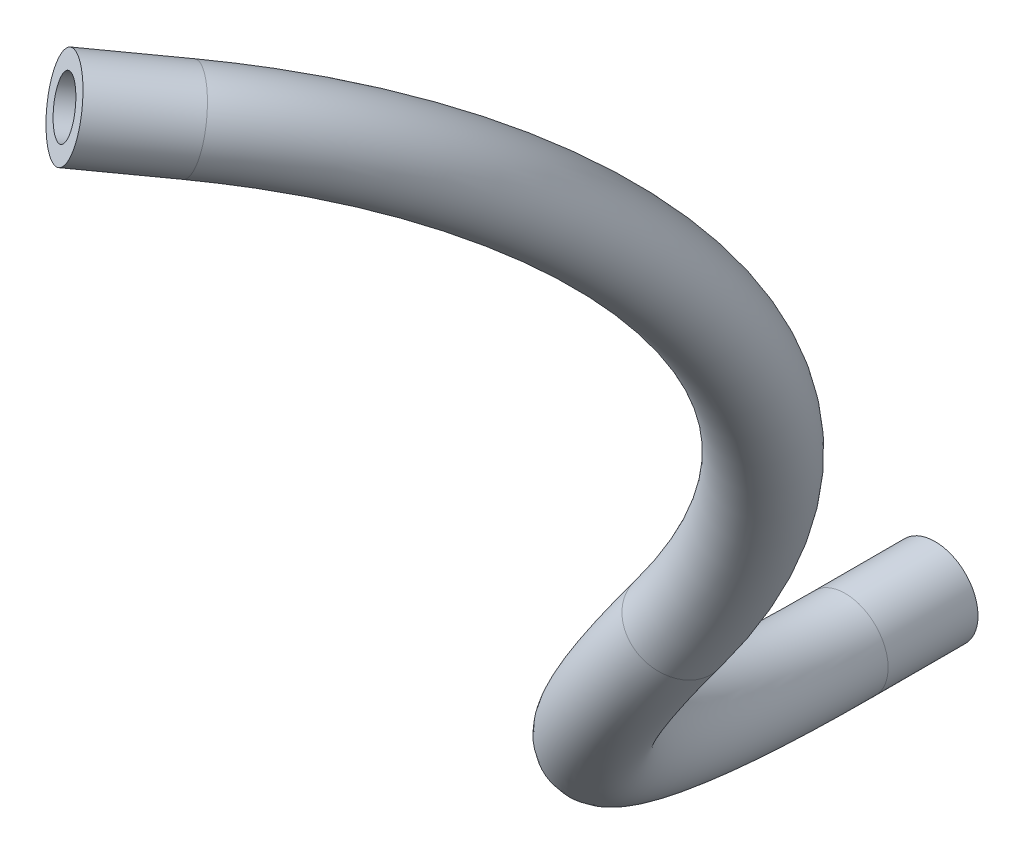
ISO-10303-21;
HEADER;
FILE_DESCRIPTION(('STEP AP214'),'2;1');
FILE_NAME('part.step','',(''),(''),'','','');
FILE_SCHEMA(('AUTOMOTIVE_DESIGN { 1 0 10303 214 1 1 1 1 }'));
ENDSEC;
DATA;
#1=APPLICATION_CONTEXT('core data for automotive mechanical design processes');
#2=APPLICATION_PROTOCOL_DEFINITION('international standard','automotive_design',2000,#1);
#3=PRODUCT_CONTEXT('',#1,'mechanical');
#4=PRODUCT('Part','Part','',(#3));
#5=PRODUCT_RELATED_PRODUCT_CATEGORY('part','',(#4));
#6=PRODUCT_DEFINITION_FORMATION('','',#4);
#7=PRODUCT_DEFINITION_CONTEXT('part definition',#1,'design');
#8=PRODUCT_DEFINITION('design','',#6,#7);
#9=PRODUCT_DEFINITION_SHAPE('','',#8);
#10=(LENGTH_UNIT() NAMED_UNIT(*) SI_UNIT(.MILLI.,.METRE.));
#11=(NAMED_UNIT(*) PLANE_ANGLE_UNIT() SI_UNIT($,.RADIAN.));
#12=(NAMED_UNIT(*) SI_UNIT($,.STERADIAN.) SOLID_ANGLE_UNIT());
#13=UNCERTAINTY_MEASURE_WITH_UNIT(LENGTH_MEASURE(1.E-05),#10,'distance_accuracy_value','');
#14=(GEOMETRIC_REPRESENTATION_CONTEXT(3) GLOBAL_UNCERTAINTY_ASSIGNED_CONTEXT((#13)) GLOBAL_UNIT_ASSIGNED_CONTEXT((#10,
#11,#12)) REPRESENTATION_CONTEXT('',''));
#15=CARTESIAN_POINT('',(0.,0.,0.));
#16=DIRECTION('',(0.,0.,1.));
#17=DIRECTION('',(1.,0.,0.));
#18=AXIS2_PLACEMENT_3D('',#15,#16,#17);
#19=CARTESIAN_POINT('',(46.6238954384085,-32.1259105562794,-21.9569738944376));
#20=DIRECTION('',(-1.65064558550588E-12,2.11386642951307E-12,1.));
#21=DIRECTION('',(0.,-1.,2.11386642951307E-12));
#22=AXIS2_PLACEMENT_3D('',#19,#20,#21);
#23=PLANE('',#22);
#24=CARTESIAN_POINT('',(46.6238954384085,-32.1259105562789,-21.9569738944376));
#25=DIRECTION('',(-1.65064558550588E-12,2.11386642951307E-12,1.));
#26=DIRECTION('',(0.,-1.,2.11386642951307E-12));
#27=AXIS2_PLACEMENT_3D('',#24,#25,#26);
#28=CIRCLE('',#27,6.35);
#29=CARTESIAN_POINT('',(46.6238954384085,-38.4759105562789,-21.9569738944242));
#30=VERTEX_POINT('',#29);
#31=EDGE_CURVE('E80',#30,#30,#28,.F.);
#32=ORIENTED_EDGE('',*,*,#31,.F.);
#33=EDGE_LOOP('',(#32));
#34=FACE_BOUND('',#33,.T.);
#35=CARTESIAN_POINT('',(46.6238954384085,-32.1259105562794,-21.9569738944376));
#36=DIRECTION('',(-1.65064558550588E-12,2.11386642951307E-12,1.));
#37=DIRECTION('',(0.,-1.,2.11386642951307E-12));
#38=AXIS2_PLACEMENT_3D('',#35,#36,#37);
#39=CIRCLE('',#38,10.31875);
#40=CARTESIAN_POINT('',(46.6238954384085,-42.4446605562794,-21.9569738944158));
#41=VERTEX_POINT('',#40);
#42=EDGE_CURVE('E77',#41,#41,#39,.T.);
#43=ORIENTED_EDGE('',*,*,#42,.F.);
#44=EDGE_LOOP('',(#43));
#45=FACE_BOUND('',#44,.T.);
#46=ADVANCED_FACE('F58',(#34,#45),#23,.F.);
#47=CARTESIAN_POINT('',(107.728390997642,234.436963267143,248.555343950868));
#48=DIRECTION('',(-0.542129637790929,0.241560198037642,0.804825525535001));
#49=DIRECTION('',(0.479741616180162,-0.697374267757238,0.532463249788098));
#50=AXIS2_PLACEMENT_3D('',#47,#48,#49);
#51=PLANE('',#50);
#52=CARTESIAN_POINT('',(107.728390997642,234.436963267143,248.555343950868));
#53=DIRECTION('',(-0.542129637790929,0.241560198037642,0.804825525535001));
#54=DIRECTION('',(0.829387132077599,0.,0.558674310438645));
#55=AXIS2_PLACEMENT_3D('',#52,#53,#54);
#56=CIRCLE('',#55,6.35);
#57=CARTESIAN_POINT('',(112.994999286335,234.436963267143,252.102925822153));
#58=VERTEX_POINT('',#57);
#59=EDGE_CURVE('E81',#58,#58,#56,.F.);
#60=ORIENTED_EDGE('',*,*,#59,.T.);
#61=EDGE_LOOP('',(#60));
#62=FACE_BOUND('',#61,.T.);
#63=CARTESIAN_POINT('',(107.728390997642,234.436963267143,248.555343950868));
#64=DIRECTION('',(-0.542129637790929,0.241560198037642,0.804825525535001));
#65=DIRECTION('',(0.479741616180162,-0.697374267757238,0.532463249788098));
#66=AXIS2_PLACEMENT_3D('',#63,#64,#65);
#67=CIRCLE('',#66,10.31875);
#68=CARTESIAN_POINT('',(112.678724799601,227.240932541723,254.049699109619));
#69=VERTEX_POINT('',#68);
#70=EDGE_CURVE('E11',#69,#69,#67,.T.);
#71=ORIENTED_EDGE('',*,*,#70,.T.);
#72=EDGE_LOOP('',(#71));
#73=FACE_BOUND('',#72,.T.);
#74=ADVANCED_FACE('F101',(#62,#73),#51,.T.);
#75=CARTESIAN_POINT('',(46.6238954384085,-32.1259105562794,-21.9569738944376));
#76=DIRECTION('',(-1.65096659787204E-12,2.11322440478157E-12,1.));
#77=DIRECTION('',(0.,-1.,2.11322440478157E-12));
#78=AXIS2_PLACEMENT_3D('',#75,#76,#77);
#79=CYLINDRICAL_SURFACE('',#78,10.31875);
#80=CARTESIAN_POINT('',(46.6238954383728,-32.1259105562337,-0.341314683768173));
#81=DIRECTION('',(-1.65064558550588E-12,2.11386642951307E-12,1.));
#82=DIRECTION('',(0.,-1.,2.11386642951307E-12));
#83=AXIS2_PLACEMENT_3D('',#80,#81,#82);
#84=CIRCLE('',#83,10.31875);
#85=CARTESIAN_POINT('',(40.5308989407746,-40.4536950901566,-0.34131468376831));
#86=VERTEX_POINT('',#85);
#87=EDGE_CURVE('E72',#86,#86,#84,.T.);
#88=ORIENTED_EDGE('',*,*,#87,.F.);
#89=EDGE_LOOP('',(#88));
#90=FACE_BOUND('',#89,.T.);
#91=ORIENTED_EDGE('',*,*,#42,.T.);
#92=EDGE_LOOP('',(#91));
#93=FACE_BOUND('',#92,.T.);
#94=ADVANCED_FACE('F105',(#90,#93),#79,.T.);
#95=CARTESIAN_POINT('',(109.255257289483,53.4773696635724,-0.341314683766761));
#96=DIRECTION('',(-0.807053619275778,0.590478158456235,0.));
#97=DIRECTION('',(-0.590478158456235,-0.807053619275779,0.));
#98=AXIS2_PLACEMENT_3D('',#95,#96,#97);
#99=TOROIDAL_SURFACE('',#98,106.068888330756,10.31875);
#100=CARTESIAN_POINT('',(111.932987356664,57.1372370291483,105.630588216354));
#101=DIRECTION('',(0.589938247278036,0.806315679583661,-0.0427538215374658));
#102=DIRECTION('',(0.496921763146011,-0.320817371988174,0.806315679583661));
#103=AXIS2_PLACEMENT_3D('',#100,#101,#102);
#104=CIRCLE('',#103,10.31875);
#105=CARTESIAN_POINT('',(112.193486241546,57.493281642917,115.939903136698));
#106=VERTEX_POINT('',#105);
#107=EDGE_CURVE('E68',#106,#106,#104,.T.);
#108=CARTESIAN_POINT('',(109.255257289483,53.4773696635724,-0.341314683766761));
#109=DIRECTION('',(-0.807053619275778,0.590478158456235,0.));
#110=DIRECTION('',(-0.590478158456235,-0.807053619275779,0.));
#111=AXIS2_PLACEMENT_3D('',#108,#109,#110);
#112=CIRCLE('',#111,116.387638330756);
#113=EDGE_CURVE('',#86,#106,#112,.T.);
#114=ORIENTED_EDGE('',*,*,#87,.T.);
#115=ORIENTED_EDGE('',*,*,#107,.F.);
#116=ORIENTED_EDGE('',*,*,#113,.T.);
#117=ORIENTED_EDGE('',*,*,#113,.F.);
#118=EDGE_LOOP('',(#114,#116,#115,#117));
#119=FACE_BOUND('',#118,.T.);
#120=ADVANCED_FACE('F107',(#119),#99,.T.);
#121=CARTESIAN_POINT('',(48.5278646567926,109.515176034297,218.557254336394));
#122=DIRECTION('',(0.667816024283635,-0.457472785836343,0.587145985193746));
#123=DIRECTION('',(0.660290584457421,0.,-0.751010215694086));
#124=AXIS2_PLACEMENT_3D('',#121,#122,#123);
#125=TOROIDAL_SURFACE('',#124,139.7,10.31875);
#126=CARTESIAN_POINT('',(119.777222197545,229.068287865757,230.668096645853));
#127=DIRECTION('',(-0.542129637790929,0.241560198037641,0.804825525535001));
#128=DIRECTION('',(0.479741616180163,-0.697374267757238,0.532463249788097));
#129=AXIS2_PLACEMENT_3D('',#126,#127,#128);
#130=CIRCLE('',#129,10.31875);
#131=CARTESIAN_POINT('',(124.727555999504,221.872257140337,236.162451804603));
#132=VERTEX_POINT('',#131);
#133=EDGE_CURVE('E64',#132,#132,#130,.T.);
#134=ORIENTED_EDGE('',*,*,#133,.F.);
#135=EDGE_LOOP('',(#134));
#136=FACE_BOUND('',#135,.T.);
#137=ORIENTED_EDGE('',*,*,#107,.T.);
#138=EDGE_LOOP('',(#137));
#139=FACE_BOUND('',#138,.T.);
#140=ADVANCED_FACE('F114',(#136,#139),#125,.T.);
#141=CARTESIAN_POINT('',(119.777222197545,229.068287865757,230.668096645853));
#142=DIRECTION('',(-0.542129637790929,0.241560198037642,0.804825525535002));
#143=DIRECTION('',(0.829387132077599,0.,0.558674310438644));
#144=AXIS2_PLACEMENT_3D('',#141,#142,#143);
#145=CYLINDRICAL_SURFACE('',#144,10.31875);
#146=ORIENTED_EDGE('',*,*,#70,.F.);
#147=EDGE_LOOP('',(#146));
#148=FACE_BOUND('',#147,.T.);
#149=ORIENTED_EDGE('',*,*,#133,.T.);
#150=EDGE_LOOP('',(#149));
#151=FACE_BOUND('',#150,.T.);
#152=ADVANCED_FACE('F120',(#148,#151),#145,.T.);
#153=CARTESIAN_POINT('',(119.777222197545,229.068287865757,230.668096645852));
#154=DIRECTION('',(-0.542129637790929,0.241560198037641,0.804825525535002));
#155=DIRECTION('',(0.8293871320776,0.,0.558674310438644));
#156=AXIS2_PLACEMENT_3D('',#153,#154,#155);
#157=CYLINDRICAL_SURFACE('',#156,6.35);
#158=CARTESIAN_POINT('',(119.777222197545,229.068287865757,230.668096645852));
#159=DIRECTION('',(-0.542129637790938,0.241560198037645,0.804825525534994));
#160=DIRECTION('',(0.479741616180157,-0.697374267757235,0.532463249788106));
#161=AXIS2_PLACEMENT_3D('',#158,#159,#160);
#162=CIRCLE('',#161,6.35);
#163=CARTESIAN_POINT('',(122.823581460289,224.639961265498,234.049238282007));
#164=VERTEX_POINT('',#163);
#165=EDGE_CURVE('E85',#164,#164,#162,.T.);
#166=ORIENTED_EDGE('',*,*,#165,.F.);
#167=EDGE_LOOP('',(#166));
#168=FACE_BOUND('',#167,.T.);
#169=ORIENTED_EDGE('',*,*,#59,.F.);
#170=EDGE_LOOP('',(#169));
#171=FACE_BOUND('',#170,.T.);
#172=ADVANCED_FACE('F102',(#168,#171),#157,.F.);
#173=CARTESIAN_POINT('',(46.6238954384102,-32.125910556281,-22.9569738944383));
#174=DIRECTION('',(-1.65098827096358E-12,2.11336316862984E-12,1.));
#175=DIRECTION('',(0.,-1.,2.11336316862984E-12));
#176=AXIS2_PLACEMENT_3D('',#173,#174,#175);
#177=CYLINDRICAL_SURFACE('',#176,6.35);
#178=ORIENTED_EDGE('',*,*,#31,.T.);
#179=EDGE_LOOP('',(#178));
#180=FACE_BOUND('',#179,.T.);
#181=CARTESIAN_POINT('',(46.6238954383871,-32.1259105562546,-0.34131468376879));
#182=DIRECTION('',(-1.65064558550588E-12,2.11386642951307E-12,1.));
#183=DIRECTION('',(0.,-1.,2.11386642951307E-12));
#184=AXIS2_PLACEMENT_3D('',#181,#182,#183);
#185=CIRCLE('',#184,6.35);
#186=CARTESIAN_POINT('',(42.8743591321714,-37.250701038673,-0.341314683768912));
#187=VERTEX_POINT('',#186);
#188=EDGE_CURVE('E84',#187,#187,#185,.T.);
#189=ORIENTED_EDGE('',*,*,#188,.T.);
#190=EDGE_LOOP('',(#189));
#191=FACE_BOUND('',#190,.T.);
#192=ADVANCED_FACE('F96',(#180,#191),#177,.F.);
#193=CARTESIAN_POINT('',(109.255257289482,53.4773696635726,-0.341314683766761));
#194=DIRECTION('',(-0.807053619275778,0.590478158456235,0.));
#195=DIRECTION('',(-0.590478158456235,-0.807053619275779,0.));
#196=AXIS2_PLACEMENT_3D('',#193,#194,#195);
#197=TOROIDAL_SURFACE('',#196,106.068888330756,6.35);
#198=CARTESIAN_POINT('',(111.932987356664,57.1372370291483,105.630588216354));
#199=DIRECTION('',(0.589938247278026,0.806315679583668,-0.0427538215374706));
#200=DIRECTION('',(0.496921763146017,-0.320817371988165,0.806315679583661));
#201=AXIS2_PLACEMENT_3D('',#198,#199,#200);
#202=CIRCLE('',#201,6.35);
#203=CARTESIAN_POINT('',(112.093294362746,57.3563414068523,111.974782013495));
#204=VERTEX_POINT('',#203);
#205=EDGE_CURVE('E88',#204,#204,#202,.T.);
#206=CARTESIAN_POINT('',(109.255257289482,53.4773696635726,-0.341314683766761));
#207=DIRECTION('',(-0.807053619275778,0.590478158456235,0.));
#208=DIRECTION('',(-0.590478158456235,-0.807053619275779,0.));
#209=AXIS2_PLACEMENT_3D('',#206,#207,#208);
#210=CIRCLE('',#209,112.418888330756);
#211=EDGE_CURVE('',#187,#204,#210,.T.);
#212=ORIENTED_EDGE('',*,*,#188,.F.);
#213=ORIENTED_EDGE('',*,*,#205,.T.);
#214=ORIENTED_EDGE('',*,*,#211,.T.);
#215=ORIENTED_EDGE('',*,*,#211,.F.);
#216=EDGE_LOOP('',(#212,#214,#213,#215));
#217=FACE_BOUND('',#216,.T.);
#218=ADVANCED_FACE('F177',(#217),#197,.F.);
#219=CARTESIAN_POINT('',(48.5278646567926,109.515176034297,218.557254336394));
#220=DIRECTION('',(0.667816024283635,-0.457472785836343,0.587145985193746));
#221=DIRECTION('',(0.660290584457421,0.,-0.751010215694086));
#222=AXIS2_PLACEMENT_3D('',#219,#220,#221);
#223=TOROIDAL_SURFACE('',#222,139.7,6.35);
#224=ORIENTED_EDGE('',*,*,#165,.T.);
#225=EDGE_LOOP('',(#224));
#226=FACE_BOUND('',#225,.T.);
#227=ORIENTED_EDGE('',*,*,#205,.F.);
#228=EDGE_LOOP('',(#227));
#229=FACE_BOUND('',#228,.T.);
#230=ADVANCED_FACE('F129',(#226,#229),#223,.F.);
#231=CLOSED_SHELL('',(#46,#74,#94,#120,#140,#152,#172,#192,#218,#230));
#232=MANIFOLD_SOLID_BREP('B2',#231);
#233=ADVANCED_BREP_SHAPE_REPRESENTATION('',(#18,#232),#14);
#234=SHAPE_DEFINITION_REPRESENTATION(#9,#233);
ENDSEC;
END-ISO-10303-21;
